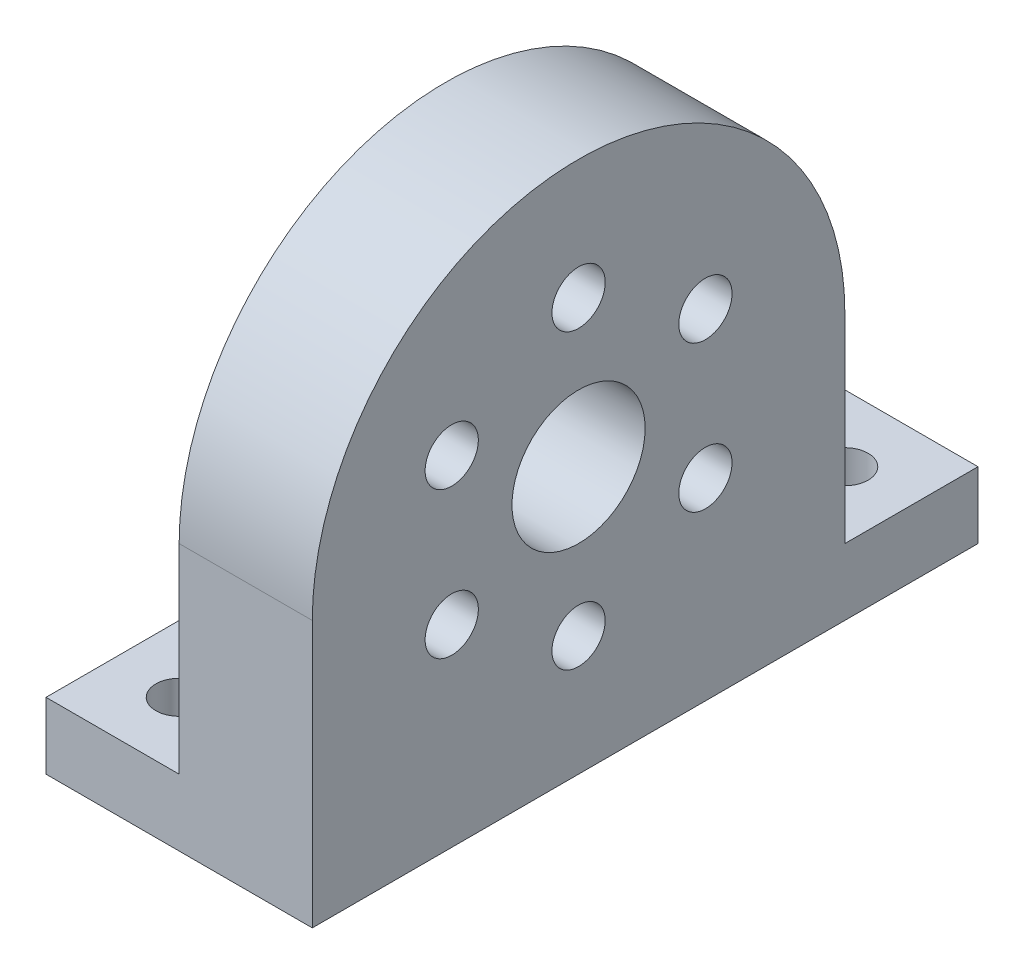
ISO-10303-21;
HEADER;
FILE_DESCRIPTION(('STEP AP214'),'2;1');
FILE_NAME('part.step','',(''),(''),'','','');
FILE_SCHEMA(('AUTOMOTIVE_DESIGN { 1 0 10303 214 1 1 1 1 }'));
ENDSEC;
DATA;
#1=APPLICATION_CONTEXT('core data for automotive mechanical design processes');
#2=APPLICATION_PROTOCOL_DEFINITION('international standard','automotive_design',2000,#1);
#3=PRODUCT_CONTEXT('',#1,'mechanical');
#4=PRODUCT('Part','Part','',(#3));
#5=PRODUCT_RELATED_PRODUCT_CATEGORY('part','',(#4));
#6=PRODUCT_DEFINITION_FORMATION('','',#4);
#7=PRODUCT_DEFINITION_CONTEXT('part definition',#1,'design');
#8=PRODUCT_DEFINITION('design','',#6,#7);
#9=PRODUCT_DEFINITION_SHAPE('','',#8);
#10=(LENGTH_UNIT() NAMED_UNIT(*) SI_UNIT(.MILLI.,.METRE.));
#11=(NAMED_UNIT(*) PLANE_ANGLE_UNIT() SI_UNIT($,.RADIAN.));
#12=(NAMED_UNIT(*) SI_UNIT($,.STERADIAN.) SOLID_ANGLE_UNIT());
#13=UNCERTAINTY_MEASURE_WITH_UNIT(LENGTH_MEASURE(1.E-05),#10,'distance_accuracy_value','');
#14=(GEOMETRIC_REPRESENTATION_CONTEXT(3) GLOBAL_UNCERTAINTY_ASSIGNED_CONTEXT((#13)) GLOBAL_UNIT_ASSIGNED_CONTEXT((#10,
#11,#12)) REPRESENTATION_CONTEXT('',''));
#15=CARTESIAN_POINT('',(0.,0.,0.));
#16=DIRECTION('',(0.,0.,1.));
#17=DIRECTION('',(1.,0.,0.));
#18=AXIS2_PLACEMENT_3D('',#15,#16,#17);
#19=CARTESIAN_POINT('',(0.,0.,0.));
#20=DIRECTION('',(1.,0.,0.));
#21=DIRECTION('',(0.,0.,-1.));
#22=AXIS2_PLACEMENT_3D('',#19,#20,#21);
#23=PLANE('',#22);
#24=CARTESIAN_POINT('',(0.,11.,0.));
#25=DIRECTION('',(-1.,0.,0.));
#26=DIRECTION('',(0.,0.,1.));
#27=AXIS2_PLACEMENT_3D('',#24,#25,#26);
#28=CIRCLE('',#27,3.15);
#29=CARTESIAN_POINT('',(0.,11.,3.15));
#30=VERTEX_POINT('',#29);
#31=EDGE_CURVE('E326',#30,#30,#28,.T.);
#32=ORIENTED_EDGE('',*,*,#31,.F.);
#33=EDGE_LOOP('',(#32));
#34=FACE_BOUND('',#33,.T.);
#35=CARTESIAN_POINT('',(0.,5.5,-9.52627944162882));
#36=DIRECTION('',(-1.,0.,0.));
#37=DIRECTION('',(0.,0.,1.));
#38=AXIS2_PLACEMENT_3D('',#35,#36,#37);
#39=CIRCLE('',#38,3.15);
#40=CARTESIAN_POINT('',(0.,5.5,-6.37627944162882));
#41=VERTEX_POINT('',#40);
#42=EDGE_CURVE('E167',#41,#41,#39,.T.);
#43=ORIENTED_EDGE('',*,*,#42,.F.);
#44=EDGE_LOOP('',(#43));
#45=FACE_BOUND('',#44,.T.);
#46=CARTESIAN_POINT('',(0.,0.,0.));
#47=DIRECTION('',(1.,0.,0.));
#48=DIRECTION('',(0.,0.,-1.));
#49=AXIS2_PLACEMENT_3D('',#46,#47,#48);
#50=CIRCLE('',#49,5.);
#51=CARTESIAN_POINT('',(0.,0.,-5.));
#52=VERTEX_POINT('',#51);
#53=EDGE_CURVE('E173',#52,#52,#50,.T.);
#54=ORIENTED_EDGE('',*,*,#53,.T.);
#55=EDGE_LOOP('',(#54));
#56=FACE_BOUND('',#55,.T.);
#57=DIRECTION('',(0.,0.,-1.));
#58=VECTOR('',#57,1.);
#59=CARTESIAN_POINT('',(0.,-20.,0.));
#60=LINE('',#59,#58);
#61=CARTESIAN_POINT('',(0.,-20.,10.));
#62=VERTEX_POINT('',#61);
#63=CARTESIAN_POINT('',(0.,-20.,-30.));
#64=VERTEX_POINT('',#63);
#65=EDGE_CURVE('E132',#62,#64,#60,.T.);
#66=ORIENTED_EDGE('',*,*,#65,.F.);
#67=DIRECTION('',(0.,1.,0.));
#68=VECTOR('',#67,1.);
#69=CARTESIAN_POINT('',(0.,0.,10.));
#70=LINE('',#69,#68);
#71=CARTESIAN_POINT('',(0.,-15.,10.));
#72=VERTEX_POINT('',#71);
#73=EDGE_CURVE('E320',#62,#72,#70,.T.);
#74=ORIENTED_EDGE('',*,*,#73,.T.);
#75=DIRECTION('',(0.,0.,1.));
#76=VECTOR('',#75,1.);
#77=CARTESIAN_POINT('',(0.,-15.,0.));
#78=LINE('',#77,#76);
#79=CARTESIAN_POINT('',(0.,-15.,20.));
#80=VERTEX_POINT('',#79);
#81=EDGE_CURVE('E319',#72,#80,#78,.T.);
#82=ORIENTED_EDGE('',*,*,#81,.T.);
#83=DIRECTION('',(0.,-1.,0.));
#84=VECTOR('',#83,1.);
#85=CARTESIAN_POINT('',(0.,0.,20.));
#86=LINE('',#85,#84);
#87=CARTESIAN_POINT('',(0.,0.,20.));
#88=VERTEX_POINT('',#87);
#89=EDGE_CURVE('E209',#88,#80,#86,.T.);
#90=ORIENTED_EDGE('',*,*,#89,.F.);
#91=CARTESIAN_POINT('',(0.,0.,0.));
#92=DIRECTION('',(1.,0.,0.));
#93=DIRECTION('',(0.,0.,-1.));
#94=AXIS2_PLACEMENT_3D('',#91,#92,#93);
#95=CIRCLE('',#94,20.);
#96=CARTESIAN_POINT('',(0.,0.,-20.));
#97=VERTEX_POINT('',#96);
#98=EDGE_CURVE('E206',#97,#88,#95,.T.);
#99=ORIENTED_EDGE('',*,*,#98,.F.);
#100=DIRECTION('',(0.,-1.,0.));
#101=VECTOR('',#100,1.);
#102=CARTESIAN_POINT('',(0.,0.,-20.));
#103=LINE('',#102,#101);
#104=CARTESIAN_POINT('',(0.,-15.,-20.));
#105=VERTEX_POINT('',#104);
#106=EDGE_CURVE('E204',#97,#105,#103,.T.);
#107=ORIENTED_EDGE('',*,*,#106,.T.);
#108=DIRECTION('',(0.,0.,-1.));
#109=VECTOR('',#108,1.);
#110=CARTESIAN_POINT('',(0.,-15.,0.));
#111=LINE('',#110,#109);
#112=CARTESIAN_POINT('',(0.,-15.,-30.));
#113=VERTEX_POINT('',#112);
#114=EDGE_CURVE('E178',#105,#113,#111,.T.);
#115=ORIENTED_EDGE('',*,*,#114,.T.);
#116=DIRECTION('',(0.,1.,0.));
#117=VECTOR('',#116,1.);
#118=CARTESIAN_POINT('',(0.,0.,-30.));
#119=LINE('',#118,#117);
#120=EDGE_CURVE('E213',#64,#113,#119,.T.);
#121=ORIENTED_EDGE('',*,*,#120,.F.);
#122=EDGE_LOOP('',(#66,#74,#82,#90,#99,#107,#115,#121));
#123=FACE_BOUND('',#122,.T.);
#124=CARTESIAN_POINT('',(0.,-5.5,-9.52627944162882));
#125=DIRECTION('',(-1.,0.,0.));
#126=DIRECTION('',(0.,0.,1.));
#127=AXIS2_PLACEMENT_3D('',#124,#125,#126);
#128=CIRCLE('',#127,3.15);
#129=CARTESIAN_POINT('',(0.,-5.5,-6.37627944162882));
#130=VERTEX_POINT('',#129);
#131=EDGE_CURVE('E144',#130,#130,#128,.T.);
#132=ORIENTED_EDGE('',*,*,#131,.F.);
#133=EDGE_LOOP('',(#132));
#134=FACE_BOUND('',#133,.T.);
#135=CARTESIAN_POINT('',(0.,-11.,0.));
#136=DIRECTION('',(-1.,0.,0.));
#137=DIRECTION('',(0.,0.,1.));
#138=AXIS2_PLACEMENT_3D('',#135,#136,#137);
#139=CIRCLE('',#138,3.15);
#140=CARTESIAN_POINT('',(0.,-11.,3.15));
#141=VERTEX_POINT('',#140);
#142=EDGE_CURVE('E145',#141,#141,#139,.T.);
#143=ORIENTED_EDGE('',*,*,#142,.F.);
#144=EDGE_LOOP('',(#143));
#145=FACE_BOUND('',#144,.T.);
#146=CARTESIAN_POINT('',(0.,-5.5,9.52627944162883));
#147=DIRECTION('',(-1.,0.,0.));
#148=DIRECTION('',(0.,0.,1.));
#149=AXIS2_PLACEMENT_3D('',#146,#147,#148);
#150=CIRCLE('',#149,3.15);
#151=CARTESIAN_POINT('',(0.,-5.5,12.6762794416288));
#152=VERTEX_POINT('',#151);
#153=EDGE_CURVE('E148',#152,#152,#150,.T.);
#154=ORIENTED_EDGE('',*,*,#153,.F.);
#155=EDGE_LOOP('',(#154));
#156=FACE_BOUND('',#155,.T.);
#157=CARTESIAN_POINT('',(0.,5.5,9.52627944162883));
#158=DIRECTION('',(-1.,0.,0.));
#159=DIRECTION('',(0.,0.,1.));
#160=AXIS2_PLACEMENT_3D('',#157,#158,#159);
#161=CIRCLE('',#160,3.15);
#162=CARTESIAN_POINT('',(0.,5.5,12.6762794416288));
#163=VERTEX_POINT('',#162);
#164=EDGE_CURVE('E158',#163,#163,#161,.T.);
#165=ORIENTED_EDGE('',*,*,#164,.F.);
#166=EDGE_LOOP('',(#165));
#167=FACE_BOUND('',#166,.T.);
#168=ADVANCED_FACE('F47',(#34,#45,#56,#123,#134,#145,#156,#167),#23,.F.);
#169=CARTESIAN_POINT('',(10.,0.,-20.));
#170=DIRECTION('',(0.,0.,-1.));
#171=DIRECTION('',(0.,1.,0.));
#172=AXIS2_PLACEMENT_3D('',#169,#170,#171);
#173=PLANE('',#172);
#174=ORIENTED_EDGE('',*,*,#106,.F.);
#175=DIRECTION('',(-1.,0.,0.));
#176=VECTOR('',#175,1.);
#177=CARTESIAN_POINT('',(10.,0.,-20.));
#178=LINE('',#177,#176);
#179=CARTESIAN_POINT('',(10.,0.,-20.));
#180=VERTEX_POINT('',#179);
#181=EDGE_CURVE('E11',#180,#97,#178,.T.);
#182=ORIENTED_EDGE('',*,*,#181,.F.);
#183=DIRECTION('',(0.,-1.,0.));
#184=VECTOR('',#183,1.);
#185=CARTESIAN_POINT('',(10.,0.,-20.));
#186=LINE('',#185,#184);
#187=CARTESIAN_POINT('',(10.,-15.,-20.));
#188=VERTEX_POINT('',#187);
#189=EDGE_CURVE('E196',#180,#188,#186,.T.);
#190=ORIENTED_EDGE('',*,*,#189,.T.);
#191=DIRECTION('',(-1.,0.,0.));
#192=VECTOR('',#191,1.);
#193=CARTESIAN_POINT('',(10.,-15.,-20.));
#194=LINE('',#193,#192);
#195=EDGE_CURVE('E73',#188,#105,#194,.T.);
#196=ORIENTED_EDGE('',*,*,#195,.T.);
#197=EDGE_LOOP('',(#174,#182,#190,#196));
#198=FACE_BOUND('',#197,.T.);
#199=ADVANCED_FACE('F222',(#198),#173,.T.);
#200=CARTESIAN_POINT('',(10.,0.,0.));
#201=DIRECTION('',(-1.,0.,0.));
#202=DIRECTION('',(0.,0.,1.));
#203=AXIS2_PLACEMENT_3D('',#200,#201,#202);
#204=CYLINDRICAL_SURFACE('',#203,20.);
#205=ORIENTED_EDGE('',*,*,#98,.T.);
#206=DIRECTION('',(-1.,0.,0.));
#207=VECTOR('',#206,1.);
#208=CARTESIAN_POINT('',(10.,0.,20.));
#209=LINE('',#208,#207);
#210=CARTESIAN_POINT('',(10.,0.,20.));
#211=VERTEX_POINT('',#210);
#212=EDGE_CURVE('E56',#211,#88,#209,.T.);
#213=ORIENTED_EDGE('',*,*,#212,.F.);
#214=CARTESIAN_POINT('',(10.,0.,0.));
#215=DIRECTION('',(1.,0.,0.));
#216=DIRECTION('',(0.,0.,-1.));
#217=AXIS2_PLACEMENT_3D('',#214,#215,#216);
#218=CIRCLE('',#217,20.);
#219=EDGE_CURVE('E198',#180,#211,#218,.T.);
#220=ORIENTED_EDGE('',*,*,#219,.F.);
#221=ORIENTED_EDGE('',*,*,#181,.T.);
#222=EDGE_LOOP('',(#205,#213,#220,#221));
#223=FACE_BOUND('',#222,.T.);
#224=ADVANCED_FACE('F224',(#223),#204,.T.);
#225=CARTESIAN_POINT('',(10.,0.,20.));
#226=DIRECTION('',(0.,0.,-1.));
#227=DIRECTION('',(0.,1.,0.));
#228=AXIS2_PLACEMENT_3D('',#225,#226,#227);
#229=PLANE('',#228);
#230=ORIENTED_EDGE('',*,*,#89,.T.);
#231=DIRECTION('',(-1.,0.,0.));
#232=VECTOR('',#231,1.);
#233=CARTESIAN_POINT('',(0.,-15.,20.));
#234=LINE('',#233,#232);
#235=CARTESIAN_POINT('',(-10.,-15.,20.));
#236=VERTEX_POINT('',#235);
#237=EDGE_CURVE('E313',#80,#236,#234,.T.);
#238=ORIENTED_EDGE('',*,*,#237,.T.);
#239=DIRECTION('',(0.,-1.,0.));
#240=VECTOR('',#239,1.);
#241=CARTESIAN_POINT('',(-10.,-15.,20.));
#242=LINE('',#241,#240);
#243=CARTESIAN_POINT('',(-10.,-20.,20.));
#244=VERTEX_POINT('',#243);
#245=EDGE_CURVE('E329',#236,#244,#242,.T.);
#246=ORIENTED_EDGE('',*,*,#245,.T.);
#247=DIRECTION('',(-1.,0.,0.));
#248=VECTOR('',#247,1.);
#249=CARTESIAN_POINT('',(10.,-20.,20.));
#250=LINE('',#249,#248);
#251=CARTESIAN_POINT('',(10.,-20.,20.));
#252=VERTEX_POINT('',#251);
#253=EDGE_CURVE('E134',#252,#244,#250,.T.);
#254=ORIENTED_EDGE('',*,*,#253,.F.);
#255=DIRECTION('',(0.,-1.,0.));
#256=VECTOR('',#255,1.);
#257=CARTESIAN_POINT('',(10.,0.,20.));
#258=LINE('',#257,#256);
#259=EDGE_CURVE('E117',#211,#252,#258,.T.);
#260=ORIENTED_EDGE('',*,*,#259,.F.);
#261=ORIENTED_EDGE('',*,*,#212,.T.);
#262=EDGE_LOOP('',(#230,#238,#246,#254,#260,#261));
#263=FACE_BOUND('',#262,.T.);
#264=ADVANCED_FACE('F229',(#263),#229,.F.);
#265=CARTESIAN_POINT('',(10.,-20.,0.));
#266=DIRECTION('',(0.,1.,0.));
#267=DIRECTION('',(0.,0.,1.));
#268=AXIS2_PLACEMENT_3D('',#265,#266,#267);
#269=PLANE('',#268);
#270=CARTESIAN_POINT('',(5.,-20.,-25.));
#271=DIRECTION('',(0.,1.,0.));
#272=DIRECTION('',(0.,0.,1.));
#273=AXIS2_PLACEMENT_3D('',#270,#271,#272);
#274=CIRCLE('',#273,1.75);
#275=CARTESIAN_POINT('',(5.,-20.,-23.25));
#276=VERTEX_POINT('',#275);
#277=EDGE_CURVE('E466',#276,#276,#274,.T.);
#278=ORIENTED_EDGE('',*,*,#277,.T.);
#279=EDGE_LOOP('',(#278));
#280=FACE_BOUND('',#279,.T.);
#281=CARTESIAN_POINT('',(-5.,-20.,15.));
#282=DIRECTION('',(0.,1.,0.));
#283=DIRECTION('',(0.,0.,1.));
#284=AXIS2_PLACEMENT_3D('',#281,#282,#283);
#285=CIRCLE('',#284,1.75);
#286=CARTESIAN_POINT('',(-5.,-20.,16.75));
#287=VERTEX_POINT('',#286);
#288=EDGE_CURVE('E476',#287,#287,#285,.T.);
#289=ORIENTED_EDGE('',*,*,#288,.T.);
#290=EDGE_LOOP('',(#289));
#291=FACE_BOUND('',#290,.T.);
#292=DIRECTION('',(-1.,0.,0.));
#293=VECTOR('',#292,1.);
#294=CARTESIAN_POINT('',(10.,-20.,-30.));
#295=LINE('',#294,#293);
#296=CARTESIAN_POINT('',(10.,-20.,-30.));
#297=VERTEX_POINT('',#296);
#298=EDGE_CURVE('E126',#297,#64,#295,.T.);
#299=ORIENTED_EDGE('',*,*,#298,.F.);
#300=DIRECTION('',(0.,0.,-1.));
#301=VECTOR('',#300,1.);
#302=CARTESIAN_POINT('',(10.,-20.,0.));
#303=LINE('',#302,#301);
#304=EDGE_CURVE('E109',#252,#297,#303,.T.);
#305=ORIENTED_EDGE('',*,*,#304,.F.);
#306=ORIENTED_EDGE('',*,*,#253,.T.);
#307=DIRECTION('',(0.,0.,-1.));
#308=VECTOR('',#307,1.);
#309=CARTESIAN_POINT('',(-10.,-20.,20.));
#310=LINE('',#309,#308);
#311=CARTESIAN_POINT('',(-10.,-20.,10.));
#312=VERTEX_POINT('',#311);
#313=EDGE_CURVE('E479',#244,#312,#310,.T.);
#314=ORIENTED_EDGE('',*,*,#313,.T.);
#315=DIRECTION('',(1.,0.,0.));
#316=VECTOR('',#315,1.);
#317=CARTESIAN_POINT('',(10.,-20.,10.));
#318=LINE('',#317,#316);
#319=EDGE_CURVE('E64',#312,#62,#318,.T.);
#320=ORIENTED_EDGE('',*,*,#319,.T.);
#321=ORIENTED_EDGE('',*,*,#65,.T.);
#322=EDGE_LOOP('',(#299,#305,#306,#314,#320,#321));
#323=FACE_BOUND('',#322,.T.);
#324=ADVANCED_FACE('F130',(#280,#291,#323),#269,.F.);
#325=CARTESIAN_POINT('',(10.,0.,-30.));
#326=DIRECTION('',(0.,0.,1.));
#327=DIRECTION('',(1.,0.,0.));
#328=AXIS2_PLACEMENT_3D('',#325,#326,#327);
#329=PLANE('',#328);
#330=ORIENTED_EDGE('',*,*,#120,.T.);
#331=DIRECTION('',(-1.,0.,0.));
#332=VECTOR('',#331,1.);
#333=CARTESIAN_POINT('',(10.,-15.,-30.));
#334=LINE('',#333,#332);
#335=CARTESIAN_POINT('',(10.,-15.,-30.));
#336=VERTEX_POINT('',#335);
#337=EDGE_CURVE('E127',#336,#113,#334,.T.);
#338=ORIENTED_EDGE('',*,*,#337,.F.);
#339=DIRECTION('',(0.,1.,0.));
#340=VECTOR('',#339,1.);
#341=CARTESIAN_POINT('',(10.,0.,-30.));
#342=LINE('',#341,#340);
#343=EDGE_CURVE('E114',#297,#336,#342,.T.);
#344=ORIENTED_EDGE('',*,*,#343,.F.);
#345=ORIENTED_EDGE('',*,*,#298,.T.);
#346=EDGE_LOOP('',(#330,#338,#344,#345));
#347=FACE_BOUND('',#346,.T.);
#348=ADVANCED_FACE('F125',(#347),#329,.F.);
#349=CARTESIAN_POINT('',(10.,5.5,9.52627944162883));
#350=DIRECTION('',(-1.,0.,0.));
#351=DIRECTION('',(0.,0.,1.));
#352=AXIS2_PLACEMENT_3D('',#349,#350,#351);
#353=CYLINDRICAL_SURFACE('',#352,2.);
#354=CARTESIAN_POINT('',(1.15,5.5,9.52627944162883));
#355=DIRECTION('',(-1.,0.,0.));
#356=DIRECTION('',(0.,0.,1.));
#357=AXIS2_PLACEMENT_3D('',#354,#355,#356);
#358=CIRCLE('',#357,2.);
#359=CARTESIAN_POINT('',(1.15,5.5,11.5262794416288));
#360=VERTEX_POINT('',#359);
#361=EDGE_CURVE('E51',#360,#360,#358,.F.);
#362=ORIENTED_EDGE('',*,*,#361,.F.);
#363=EDGE_LOOP('',(#362));
#364=FACE_BOUND('',#363,.T.);
#365=CARTESIAN_POINT('',(10.,5.5,9.52627944162883));
#366=DIRECTION('',(1.,0.,0.));
#367=DIRECTION('',(0.,0.,-1.));
#368=AXIS2_PLACEMENT_3D('',#365,#366,#367);
#369=CIRCLE('',#368,2.);
#370=CARTESIAN_POINT('',(10.,5.5,7.52627944162883));
#371=VERTEX_POINT('',#370);
#372=EDGE_CURVE('E193',#371,#371,#369,.T.);
#373=ORIENTED_EDGE('',*,*,#372,.T.);
#374=EDGE_LOOP('',(#373));
#375=FACE_BOUND('',#374,.T.);
#376=ADVANCED_FACE('F237',(#364,#375),#353,.F.);
#377=CARTESIAN_POINT('',(10.,-5.5,9.52627944162883));
#378=DIRECTION('',(-1.,0.,0.));
#379=DIRECTION('',(0.,0.,1.));
#380=AXIS2_PLACEMENT_3D('',#377,#378,#379);
#381=CYLINDRICAL_SURFACE('',#380,2.);
#382=CARTESIAN_POINT('',(1.15,-5.5,9.52627944162883));
#383=DIRECTION('',(-1.,0.,0.));
#384=DIRECTION('',(0.,0.,1.));
#385=AXIS2_PLACEMENT_3D('',#382,#383,#384);
#386=CIRCLE('',#385,2.);
#387=CARTESIAN_POINT('',(1.15,-5.5,11.5262794416288));
#388=VERTEX_POINT('',#387);
#389=EDGE_CURVE('E146',#388,#388,#386,.F.);
#390=ORIENTED_EDGE('',*,*,#389,.F.);
#391=EDGE_LOOP('',(#390));
#392=FACE_BOUND('',#391,.T.);
#393=CARTESIAN_POINT('',(10.,-5.5,9.52627944162883));
#394=DIRECTION('',(1.,0.,0.));
#395=DIRECTION('',(0.,0.,-1.));
#396=AXIS2_PLACEMENT_3D('',#393,#394,#395);
#397=CIRCLE('',#396,2.);
#398=CARTESIAN_POINT('',(10.,-5.5,7.52627944162883));
#399=VERTEX_POINT('',#398);
#400=EDGE_CURVE('E190',#399,#399,#397,.T.);
#401=ORIENTED_EDGE('',*,*,#400,.T.);
#402=EDGE_LOOP('',(#401));
#403=FACE_BOUND('',#402,.T.);
#404=ADVANCED_FACE('F240',(#392,#403),#381,.F.);
#405=CARTESIAN_POINT('',(10.,-11.,0.));
#406=DIRECTION('',(-1.,0.,0.));
#407=DIRECTION('',(0.,0.,1.));
#408=AXIS2_PLACEMENT_3D('',#405,#406,#407);
#409=CYLINDRICAL_SURFACE('',#408,2.);
#410=CARTESIAN_POINT('',(1.15,-11.,0.));
#411=DIRECTION('',(-1.,0.,0.));
#412=DIRECTION('',(0.,0.,1.));
#413=AXIS2_PLACEMENT_3D('',#410,#411,#412);
#414=CIRCLE('',#413,2.);
#415=CARTESIAN_POINT('',(1.15,-11.,2.));
#416=VERTEX_POINT('',#415);
#417=EDGE_CURVE('E142',#416,#416,#414,.F.);
#418=ORIENTED_EDGE('',*,*,#417,.F.);
#419=EDGE_LOOP('',(#418));
#420=FACE_BOUND('',#419,.T.);
#421=CARTESIAN_POINT('',(10.,-11.,0.));
#422=DIRECTION('',(1.,0.,0.));
#423=DIRECTION('',(0.,0.,-1.));
#424=AXIS2_PLACEMENT_3D('',#421,#422,#423);
#425=CIRCLE('',#424,2.);
#426=CARTESIAN_POINT('',(10.,-11.,-2.));
#427=VERTEX_POINT('',#426);
#428=EDGE_CURVE('E187',#427,#427,#425,.T.);
#429=ORIENTED_EDGE('',*,*,#428,.T.);
#430=EDGE_LOOP('',(#429));
#431=FACE_BOUND('',#430,.T.);
#432=ADVANCED_FACE('F244',(#420,#431),#409,.F.);
#433=CARTESIAN_POINT('',(10.,-5.5,-9.52627944162882));
#434=DIRECTION('',(-1.,0.,0.));
#435=DIRECTION('',(0.,0.,1.));
#436=AXIS2_PLACEMENT_3D('',#433,#434,#435);
#437=CYLINDRICAL_SURFACE('',#436,2.);
#438=CARTESIAN_POINT('',(1.15,-5.5,-9.52627944162882));
#439=DIRECTION('',(-1.,0.,0.));
#440=DIRECTION('',(0.,0.,1.));
#441=AXIS2_PLACEMENT_3D('',#438,#439,#440);
#442=CIRCLE('',#441,2.);
#443=CARTESIAN_POINT('',(1.15,-5.5,-7.52627944162882));
#444=VERTEX_POINT('',#443);
#445=EDGE_CURVE('E164',#444,#444,#442,.F.);
#446=ORIENTED_EDGE('',*,*,#445,.F.);
#447=EDGE_LOOP('',(#446));
#448=FACE_BOUND('',#447,.T.);
#449=CARTESIAN_POINT('',(10.,-5.5,-9.52627944162882));
#450=DIRECTION('',(1.,0.,0.));
#451=DIRECTION('',(0.,0.,-1.));
#452=AXIS2_PLACEMENT_3D('',#449,#450,#451);
#453=CIRCLE('',#452,2.);
#454=CARTESIAN_POINT('',(10.,-5.5,-11.5262794416288));
#455=VERTEX_POINT('',#454);
#456=EDGE_CURVE('E184',#455,#455,#453,.T.);
#457=ORIENTED_EDGE('',*,*,#456,.T.);
#458=EDGE_LOOP('',(#457));
#459=FACE_BOUND('',#458,.T.);
#460=ADVANCED_FACE('F248',(#448,#459),#437,.F.);
#461=CARTESIAN_POINT('',(10.,5.5,-9.52627944162882));
#462=DIRECTION('',(-1.,0.,0.));
#463=DIRECTION('',(0.,0.,1.));
#464=AXIS2_PLACEMENT_3D('',#461,#462,#463);
#465=CYLINDRICAL_SURFACE('',#464,2.);
#466=CARTESIAN_POINT('',(1.15,5.5,-9.52627944162882));
#467=DIRECTION('',(-1.,0.,0.));
#468=DIRECTION('',(0.,0.,1.));
#469=AXIS2_PLACEMENT_3D('',#466,#467,#468);
#470=CIRCLE('',#469,2.);
#471=CARTESIAN_POINT('',(1.15,5.5,-7.52627944162882));
#472=VERTEX_POINT('',#471);
#473=EDGE_CURVE('E170',#472,#472,#470,.F.);
#474=ORIENTED_EDGE('',*,*,#473,.F.);
#475=EDGE_LOOP('',(#474));
#476=FACE_BOUND('',#475,.T.);
#477=CARTESIAN_POINT('',(10.,5.5,-9.52627944162882));
#478=DIRECTION('',(1.,0.,0.));
#479=DIRECTION('',(0.,0.,-1.));
#480=AXIS2_PLACEMENT_3D('',#477,#478,#479);
#481=CIRCLE('',#480,2.);
#482=CARTESIAN_POINT('',(10.,5.5,-11.5262794416288));
#483=VERTEX_POINT('',#482);
#484=EDGE_CURVE('E181',#483,#483,#481,.T.);
#485=ORIENTED_EDGE('',*,*,#484,.T.);
#486=EDGE_LOOP('',(#485));
#487=FACE_BOUND('',#486,.T.);
#488=ADVANCED_FACE('F252',(#476,#487),#465,.F.);
#489=CARTESIAN_POINT('',(10.,11.,0.));
#490=DIRECTION('',(-1.,0.,0.));
#491=DIRECTION('',(0.,0.,1.));
#492=AXIS2_PLACEMENT_3D('',#489,#490,#491);
#493=CYLINDRICAL_SURFACE('',#492,2.);
#494=CARTESIAN_POINT('',(1.15,11.,0.));
#495=DIRECTION('',(-1.,0.,0.));
#496=DIRECTION('',(0.,0.,1.));
#497=AXIS2_PLACEMENT_3D('',#494,#495,#496);
#498=CIRCLE('',#497,2.);
#499=CARTESIAN_POINT('',(1.15,11.,2.));
#500=VERTEX_POINT('',#499);
#501=EDGE_CURVE('E267',#500,#500,#498,.F.);
#502=ORIENTED_EDGE('',*,*,#501,.F.);
#503=EDGE_LOOP('',(#502));
#504=FACE_BOUND('',#503,.T.);
#505=CARTESIAN_POINT('',(10.,11.,0.));
#506=DIRECTION('',(1.,0.,0.));
#507=DIRECTION('',(0.,0.,-1.));
#508=AXIS2_PLACEMENT_3D('',#505,#506,#507);
#509=CIRCLE('',#508,2.);
#510=CARTESIAN_POINT('',(10.,11.,-2.));
#511=VERTEX_POINT('',#510);
#512=EDGE_CURVE('E177',#511,#511,#509,.T.);
#513=ORIENTED_EDGE('',*,*,#512,.T.);
#514=EDGE_LOOP('',(#513));
#515=FACE_BOUND('',#514,.T.);
#516=ADVANCED_FACE('F255',(#504,#515),#493,.F.);
#517=CARTESIAN_POINT('',(10.,0.,0.));
#518=DIRECTION('',(-1.,0.,0.));
#519=DIRECTION('',(0.,0.,1.));
#520=AXIS2_PLACEMENT_3D('',#517,#518,#519);
#521=CYLINDRICAL_SURFACE('',#520,5.);
#522=CARTESIAN_POINT('',(10.,0.,0.));
#523=DIRECTION('',(1.,0.,0.));
#524=DIRECTION('',(0.,0.,-1.));
#525=AXIS2_PLACEMENT_3D('',#522,#523,#524);
#526=CIRCLE('',#525,5.);
#527=CARTESIAN_POINT('',(10.,0.,-5.));
#528=VERTEX_POINT('',#527);
#529=EDGE_CURVE('E174',#528,#528,#526,.T.);
#530=ORIENTED_EDGE('',*,*,#529,.T.);
#531=EDGE_LOOP('',(#530));
#532=FACE_BOUND('',#531,.T.);
#533=ORIENTED_EDGE('',*,*,#53,.F.);
#534=EDGE_LOOP('',(#533));
#535=FACE_BOUND('',#534,.T.);
#536=ADVANCED_FACE('F49',(#532,#535),#521,.F.);
#537=CARTESIAN_POINT('',(10.,-15.,0.));
#538=DIRECTION('',(0.,1.,0.));
#539=DIRECTION('',(0.,0.,1.));
#540=AXIS2_PLACEMENT_3D('',#537,#538,#539);
#541=PLANE('',#540);
#542=CARTESIAN_POINT('',(5.,-15.,-25.));
#543=DIRECTION('',(0.,1.,0.));
#544=DIRECTION('',(0.,0.,1.));
#545=AXIS2_PLACEMENT_3D('',#542,#543,#544);
#546=CIRCLE('',#545,1.75);
#547=CARTESIAN_POINT('',(5.,-15.,-23.25));
#548=VERTEX_POINT('',#547);
#549=EDGE_CURVE('E469',#548,#548,#546,.T.);
#550=ORIENTED_EDGE('',*,*,#549,.F.);
#551=EDGE_LOOP('',(#550));
#552=FACE_BOUND('',#551,.T.);
#553=ORIENTED_EDGE('',*,*,#114,.F.);
#554=ORIENTED_EDGE('',*,*,#195,.F.);
#555=DIRECTION('',(0.,0.,-1.));
#556=VECTOR('',#555,1.);
#557=CARTESIAN_POINT('',(10.,-15.,0.));
#558=LINE('',#557,#556);
#559=EDGE_CURVE('E128',#188,#336,#558,.T.);
#560=ORIENTED_EDGE('',*,*,#559,.T.);
#561=ORIENTED_EDGE('',*,*,#337,.T.);
#562=EDGE_LOOP('',(#553,#554,#560,#561));
#563=FACE_BOUND('',#562,.T.);
#564=ADVANCED_FACE('F219',(#552,#563),#541,.T.);
#565=CARTESIAN_POINT('',(10.,0.,0.));
#566=DIRECTION('',(1.,0.,0.));
#567=DIRECTION('',(0.,0.,-1.));
#568=AXIS2_PLACEMENT_3D('',#565,#566,#567);
#569=PLANE('',#568);
#570=ORIENTED_EDGE('',*,*,#304,.T.);
#571=ORIENTED_EDGE('',*,*,#343,.T.);
#572=ORIENTED_EDGE('',*,*,#559,.F.);
#573=ORIENTED_EDGE('',*,*,#189,.F.);
#574=ORIENTED_EDGE('',*,*,#219,.T.);
#575=ORIENTED_EDGE('',*,*,#259,.T.);
#576=EDGE_LOOP('',(#570,#571,#572,#573,#574,#575));
#577=FACE_BOUND('',#576,.T.);
#578=ORIENTED_EDGE('',*,*,#529,.F.);
#579=EDGE_LOOP('',(#578));
#580=FACE_BOUND('',#579,.T.);
#581=ORIENTED_EDGE('',*,*,#512,.F.);
#582=EDGE_LOOP('',(#581));
#583=FACE_BOUND('',#582,.T.);
#584=ORIENTED_EDGE('',*,*,#484,.F.);
#585=EDGE_LOOP('',(#584));
#586=FACE_BOUND('',#585,.T.);
#587=ORIENTED_EDGE('',*,*,#456,.F.);
#588=EDGE_LOOP('',(#587));
#589=FACE_BOUND('',#588,.T.);
#590=ORIENTED_EDGE('',*,*,#428,.F.);
#591=EDGE_LOOP('',(#590));
#592=FACE_BOUND('',#591,.T.);
#593=ORIENTED_EDGE('',*,*,#400,.F.);
#594=EDGE_LOOP('',(#593));
#595=FACE_BOUND('',#594,.T.);
#596=ORIENTED_EDGE('',*,*,#372,.F.);
#597=EDGE_LOOP('',(#596));
#598=FACE_BOUND('',#597,.T.);
#599=ADVANCED_FACE('F111',(#577,#580,#583,#586,#589,#592,#595,#598),#569,.T.);
#600=CARTESIAN_POINT('',(0.,5.5,-9.52627944162882));
#601=DIRECTION('',(-1.,0.,0.));
#602=DIRECTION('',(0.,0.,1.));
#603=AXIS2_PLACEMENT_3D('',#600,#601,#602);
#604=CONICAL_SURFACE('',#603,3.15,0.785398163397449);
#605=ORIENTED_EDGE('',*,*,#473,.T.);
#606=EDGE_LOOP('',(#605));
#607=FACE_BOUND('',#606,.T.);
#608=ORIENTED_EDGE('',*,*,#42,.T.);
#609=EDGE_LOOP('',(#608));
#610=FACE_BOUND('',#609,.T.);
#611=ADVANCED_FACE('F272',(#607,#610),#604,.F.);
#612=CARTESIAN_POINT('',(0.,-5.5,-9.52627944162882));
#613=DIRECTION('',(-1.,0.,0.));
#614=DIRECTION('',(0.,0.,1.));
#615=AXIS2_PLACEMENT_3D('',#612,#613,#614);
#616=CONICAL_SURFACE('',#615,3.15,0.785398163397449);
#617=ORIENTED_EDGE('',*,*,#445,.T.);
#618=EDGE_LOOP('',(#617));
#619=FACE_BOUND('',#618,.T.);
#620=ORIENTED_EDGE('',*,*,#131,.T.);
#621=EDGE_LOOP('',(#620));
#622=FACE_BOUND('',#621,.T.);
#623=ADVANCED_FACE('F292',(#619,#622),#616,.F.);
#624=CARTESIAN_POINT('',(0.,-11.,0.));
#625=DIRECTION('',(-1.,0.,0.));
#626=DIRECTION('',(0.,0.,1.));
#627=AXIS2_PLACEMENT_3D('',#624,#625,#626);
#628=CONICAL_SURFACE('',#627,3.15,0.785398163397449);
#629=ORIENTED_EDGE('',*,*,#417,.T.);
#630=EDGE_LOOP('',(#629));
#631=FACE_BOUND('',#630,.T.);
#632=ORIENTED_EDGE('',*,*,#142,.T.);
#633=EDGE_LOOP('',(#632));
#634=FACE_BOUND('',#633,.T.);
#635=ADVANCED_FACE('F351',(#631,#634),#628,.F.);
#636=CARTESIAN_POINT('',(0.,-5.5,9.52627944162883));
#637=DIRECTION('',(-1.,0.,0.));
#638=DIRECTION('',(0.,0.,1.));
#639=AXIS2_PLACEMENT_3D('',#636,#637,#638);
#640=CONICAL_SURFACE('',#639,3.15,0.785398163397449);
#641=ORIENTED_EDGE('',*,*,#389,.T.);
#642=EDGE_LOOP('',(#641));
#643=FACE_BOUND('',#642,.T.);
#644=ORIENTED_EDGE('',*,*,#153,.T.);
#645=EDGE_LOOP('',(#644));
#646=FACE_BOUND('',#645,.T.);
#647=ADVANCED_FACE('F342',(#643,#646),#640,.F.);
#648=CARTESIAN_POINT('',(0.,5.5,9.52627944162883));
#649=DIRECTION('',(-1.,0.,0.));
#650=DIRECTION('',(0.,0.,1.));
#651=AXIS2_PLACEMENT_3D('',#648,#649,#650);
#652=CONICAL_SURFACE('',#651,3.15,0.785398163397449);
#653=ORIENTED_EDGE('',*,*,#361,.T.);
#654=EDGE_LOOP('',(#653));
#655=FACE_BOUND('',#654,.T.);
#656=ORIENTED_EDGE('',*,*,#164,.T.);
#657=EDGE_LOOP('',(#656));
#658=FACE_BOUND('',#657,.T.);
#659=ADVANCED_FACE('F338',(#655,#658),#652,.F.);
#660=CARTESIAN_POINT('',(0.,11.,0.));
#661=DIRECTION('',(-1.,0.,0.));
#662=DIRECTION('',(0.,0.,1.));
#663=AXIS2_PLACEMENT_3D('',#660,#661,#662);
#664=CONICAL_SURFACE('',#663,3.15,0.785398163397449);
#665=ORIENTED_EDGE('',*,*,#501,.T.);
#666=EDGE_LOOP('',(#665));
#667=FACE_BOUND('',#666,.T.);
#668=ORIENTED_EDGE('',*,*,#31,.T.);
#669=EDGE_LOOP('',(#668));
#670=FACE_BOUND('',#669,.T.);
#671=ADVANCED_FACE('F341',(#667,#670),#664,.F.);
#672=CARTESIAN_POINT('',(10.,-15.,10.));
#673=DIRECTION('',(0.,0.,-1.));
#674=DIRECTION('',(-1.,0.,0.));
#675=AXIS2_PLACEMENT_3D('',#672,#673,#674);
#676=PLANE('',#675);
#677=ORIENTED_EDGE('',*,*,#73,.F.);
#678=ORIENTED_EDGE('',*,*,#319,.F.);
#679=DIRECTION('',(0.,-1.,0.));
#680=VECTOR('',#679,1.);
#681=CARTESIAN_POINT('',(-10.,-15.,10.));
#682=LINE('',#681,#680);
#683=CARTESIAN_POINT('',(-10.,-15.,10.));
#684=VERTEX_POINT('',#683);
#685=EDGE_CURVE('E324',#684,#312,#682,.T.);
#686=ORIENTED_EDGE('',*,*,#685,.F.);
#687=DIRECTION('',(1.,0.,0.));
#688=VECTOR('',#687,1.);
#689=CARTESIAN_POINT('',(-10.,-15.,10.));
#690=LINE('',#689,#688);
#691=EDGE_CURVE('E484',#684,#72,#690,.T.);
#692=ORIENTED_EDGE('',*,*,#691,.T.);
#693=EDGE_LOOP('',(#677,#678,#686,#692));
#694=FACE_BOUND('',#693,.T.);
#695=ADVANCED_FACE('F349',(#694),#676,.T.);
#696=CARTESIAN_POINT('',(0.,-15.,0.));
#697=DIRECTION('',(0.,1.,0.));
#698=DIRECTION('',(0.,0.,1.));
#699=AXIS2_PLACEMENT_3D('',#696,#697,#698);
#700=PLANE('',#699);
#701=CARTESIAN_POINT('',(-5.,-15.,15.));
#702=DIRECTION('',(0.,1.,0.));
#703=DIRECTION('',(0.,0.,1.));
#704=AXIS2_PLACEMENT_3D('',#701,#702,#703);
#705=CIRCLE('',#704,1.75);
#706=CARTESIAN_POINT('',(-5.,-15.,16.75));
#707=VERTEX_POINT('',#706);
#708=EDGE_CURVE('E471',#707,#707,#705,.T.);
#709=ORIENTED_EDGE('',*,*,#708,.F.);
#710=EDGE_LOOP('',(#709));
#711=FACE_BOUND('',#710,.T.);
#712=ORIENTED_EDGE('',*,*,#81,.F.);
#713=ORIENTED_EDGE('',*,*,#691,.F.);
#714=DIRECTION('',(0.,0.,-1.));
#715=VECTOR('',#714,1.);
#716=CARTESIAN_POINT('',(-10.,-15.,20.));
#717=LINE('',#716,#715);
#718=EDGE_CURVE('E481',#236,#684,#717,.T.);
#719=ORIENTED_EDGE('',*,*,#718,.F.);
#720=ORIENTED_EDGE('',*,*,#237,.F.);
#721=EDGE_LOOP('',(#712,#713,#719,#720));
#722=FACE_BOUND('',#721,.T.);
#723=ADVANCED_FACE('F419',(#711,#722),#700,.T.);
#724=CARTESIAN_POINT('',(-10.,-15.,20.));
#725=DIRECTION('',(-1.,0.,0.));
#726=DIRECTION('',(0.,0.,1.));
#727=AXIS2_PLACEMENT_3D('',#724,#725,#726);
#728=PLANE('',#727);
#729=ORIENTED_EDGE('',*,*,#313,.F.);
#730=ORIENTED_EDGE('',*,*,#245,.F.);
#731=ORIENTED_EDGE('',*,*,#718,.T.);
#732=ORIENTED_EDGE('',*,*,#685,.T.);
#733=EDGE_LOOP('',(#729,#730,#731,#732));
#734=FACE_BOUND('',#733,.T.);
#735=ADVANCED_FACE('F432',(#734),#728,.T.);
#736=CARTESIAN_POINT('',(-5.,-15.,15.));
#737=DIRECTION('',(0.,1.,0.));
#738=DIRECTION('',(0.,0.,1.));
#739=AXIS2_PLACEMENT_3D('',#736,#737,#738);
#740=CYLINDRICAL_SURFACE('',#739,1.75);
#741=ORIENTED_EDGE('',*,*,#288,.F.);
#742=EDGE_LOOP('',(#741));
#743=FACE_BOUND('',#742,.T.);
#744=ORIENTED_EDGE('',*,*,#708,.T.);
#745=EDGE_LOOP('',(#744));
#746=FACE_BOUND('',#745,.T.);
#747=ADVANCED_FACE('F442',(#743,#746),#740,.F.);
#748=CARTESIAN_POINT('',(5.,-15.,-25.));
#749=DIRECTION('',(0.,1.,0.));
#750=DIRECTION('',(0.,0.,1.));
#751=AXIS2_PLACEMENT_3D('',#748,#749,#750);
#752=CYLINDRICAL_SURFACE('',#751,1.75);
#753=ORIENTED_EDGE('',*,*,#277,.F.);
#754=EDGE_LOOP('',(#753));
#755=FACE_BOUND('',#754,.T.);
#756=ORIENTED_EDGE('',*,*,#549,.T.);
#757=EDGE_LOOP('',(#756));
#758=FACE_BOUND('',#757,.T.);
#759=ADVANCED_FACE('F450',(#755,#758),#752,.F.);
#760=CLOSED_SHELL('',(#168,#199,#224,#264,#324,#348,#376,#404,#432,#460,#488,#516,#536,#564,
#599,#611,#623,#635,#647,#659,#671,#695,#723,#735,#747,#759));
#761=MANIFOLD_SOLID_BREP('B2',#760);
#762=ADVANCED_BREP_SHAPE_REPRESENTATION('',(#18,#761),#14);
#763=SHAPE_DEFINITION_REPRESENTATION(#9,#762);
ENDSEC;
END-ISO-10303-21;
